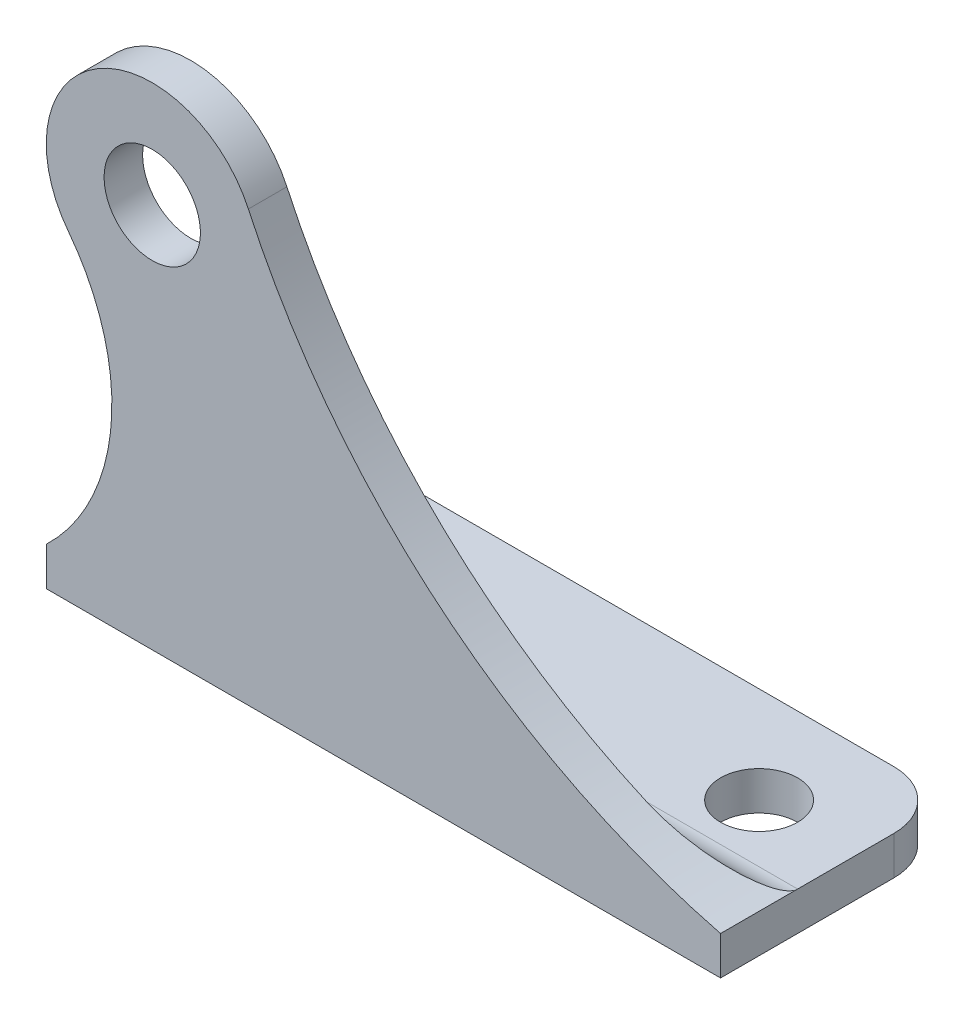
ISO-10303-21;
HEADER;
FILE_DESCRIPTION(('STEP AP214'),'2;1');
FILE_NAME('part.step','',(''),(''),'','','');
FILE_SCHEMA(('AUTOMOTIVE_DESIGN { 1 0 10303 214 1 1 1 1 }'));
ENDSEC;
DATA;
#1=APPLICATION_CONTEXT('core data for automotive mechanical design processes');
#2=APPLICATION_PROTOCOL_DEFINITION('international standard','automotive_design',2000,#1);
#3=PRODUCT_CONTEXT('',#1,'mechanical');
#4=PRODUCT('Part','Part','',(#3));
#5=PRODUCT_RELATED_PRODUCT_CATEGORY('part','',(#4));
#6=PRODUCT_DEFINITION_FORMATION('','',#4);
#7=PRODUCT_DEFINITION_CONTEXT('part definition',#1,'design');
#8=PRODUCT_DEFINITION('design','',#6,#7);
#9=PRODUCT_DEFINITION_SHAPE('','',#8);
#10=(LENGTH_UNIT() NAMED_UNIT(*) SI_UNIT(.MILLI.,.METRE.));
#11=(NAMED_UNIT(*) PLANE_ANGLE_UNIT() SI_UNIT($,.RADIAN.));
#12=(NAMED_UNIT(*) SI_UNIT($,.STERADIAN.) SOLID_ANGLE_UNIT());
#13=UNCERTAINTY_MEASURE_WITH_UNIT(LENGTH_MEASURE(1.E-05),#10,'distance_accuracy_value','');
#14=(GEOMETRIC_REPRESENTATION_CONTEXT(3) GLOBAL_UNCERTAINTY_ASSIGNED_CONTEXT((#13)) GLOBAL_UNIT_ASSIGNED_CONTEXT((#10,
#11,#12)) REPRESENTATION_CONTEXT('',''));
#15=CARTESIAN_POINT('',(0.,0.,0.));
#16=DIRECTION('',(0.,0.,1.));
#17=DIRECTION('',(1.,0.,0.));
#18=AXIS2_PLACEMENT_3D('',#15,#16,#17);
#19=CARTESIAN_POINT('',(29.5,0.,2.));
#20=DIRECTION('',(0.,1.,0.));
#21=DIRECTION('',(-1.,0.,0.));
#22=AXIS2_PLACEMENT_3D('',#19,#20,#21);
#23=PLANE('',#22);
#24=CARTESIAN_POINT('',(-0.500000000000004,0.,-7.));
#25=DIRECTION('',(0.,-1.,0.));
#26=DIRECTION('',(0.,0.,-1.));
#27=AXIS2_PLACEMENT_3D('',#24,#25,#26);
#28=CIRCLE('',#27,2.);
#29=CARTESIAN_POINT('',(-0.500000000000004,0.,-9.));
#30=VERTEX_POINT('',#29);
#31=EDGE_CURVE('E216',#30,#30,#28,.T.);
#32=ORIENTED_EDGE('',*,*,#31,.F.);
#33=EDGE_LOOP('',(#32));
#34=FACE_BOUND('',#33,.T.);
#35=CARTESIAN_POINT('',(24.5,0.,-7.));
#36=DIRECTION('',(0.,-1.,0.));
#37=DIRECTION('',(0.,0.,-1.));
#38=AXIS2_PLACEMENT_3D('',#35,#36,#37);
#39=CIRCLE('',#38,2.);
#40=CARTESIAN_POINT('',(24.5,0.,-9.));
#41=VERTEX_POINT('',#40);
#42=EDGE_CURVE('E219',#41,#41,#39,.T.);
#43=ORIENTED_EDGE('',*,*,#42,.F.);
#44=EDGE_LOOP('',(#43));
#45=FACE_BOUND('',#44,.T.);
#46=DIRECTION('',(0.,0.,-1.));
#47=VECTOR('',#46,1.);
#48=CARTESIAN_POINT('',(29.5,0.,2.));
#49=LINE('',#48,#47);
#50=CARTESIAN_POINT('',(29.5,0.,0.));
#51=VERTEX_POINT('',#50);
#52=CARTESIAN_POINT('',(29.5,0.,-9.));
#53=VERTEX_POINT('',#52);
#54=EDGE_CURVE('E130',#51,#53,#49,.T.);
#55=ORIENTED_EDGE('',*,*,#54,.F.);
#56=DIRECTION('',(1.,0.,0.));
#57=VECTOR('',#56,1.);
#58=CARTESIAN_POINT('',(-5.6798460655518,0.,0.));
#59=LINE('',#58,#57);
#60=CARTESIAN_POINT('',(-5.5,0.,0.));
#61=VERTEX_POINT('',#60);
#62=EDGE_CURVE('E118',#61,#51,#59,.T.);
#63=ORIENTED_EDGE('',*,*,#62,.F.);
#64=DIRECTION('',(0.,0.,-1.));
#65=VECTOR('',#64,1.);
#66=CARTESIAN_POINT('',(-5.5,0.,2.));
#67=LINE('',#66,#65);
#68=CARTESIAN_POINT('',(-5.5,0.,-9.));
#69=VERTEX_POINT('',#68);
#70=EDGE_CURVE('E127',#61,#69,#67,.T.);
#71=ORIENTED_EDGE('',*,*,#70,.T.);
#72=CARTESIAN_POINT('',(-2.5,0.,-9.));
#73=DIRECTION('',(0.,1.,0.));
#74=DIRECTION('',(-1.,0.,0.));
#75=AXIS2_PLACEMENT_3D('',#72,#73,#74);
#76=CIRCLE('',#75,3.);
#77=CARTESIAN_POINT('',(-2.5,0.,-12.));
#78=VERTEX_POINT('',#77);
#79=EDGE_CURVE('E313',#69,#78,#76,.F.);
#80=ORIENTED_EDGE('',*,*,#79,.T.);
#81=DIRECTION('',(1.,0.,0.));
#82=VECTOR('',#81,1.);
#83=CARTESIAN_POINT('',(-5.5,0.,-12.));
#84=LINE('',#83,#82);
#85=CARTESIAN_POINT('',(26.5,0.,-12.));
#86=VERTEX_POINT('',#85);
#87=EDGE_CURVE('E238',#78,#86,#84,.T.);
#88=ORIENTED_EDGE('',*,*,#87,.T.);
#89=CARTESIAN_POINT('',(26.5,0.,-9.));
#90=DIRECTION('',(0.,1.,0.));
#91=DIRECTION('',(-1.,0.,0.));
#92=AXIS2_PLACEMENT_3D('',#89,#90,#91);
#93=CIRCLE('',#92,3.);
#94=EDGE_CURVE('E316',#86,#53,#93,.F.);
#95=ORIENTED_EDGE('',*,*,#94,.T.);
#96=EDGE_LOOP('',(#55,#63,#71,#80,#88,#95));
#97=FACE_BOUND('',#96,.T.);
#98=ADVANCED_FACE('F39',(#34,#45,#97),#23,.F.);
#99=CARTESIAN_POINT('',(29.5,2.,2.));
#100=DIRECTION('',(-1.,0.,0.));
#101=DIRECTION('',(0.,0.,1.));
#102=AXIS2_PLACEMENT_3D('',#99,#100,#101);
#103=PLANE('',#102);
#104=DIRECTION('',(0.,0.,-1.));
#105=VECTOR('',#104,1.);
#106=CARTESIAN_POINT('',(29.5,2.00000000000001,2.));
#107=LINE('',#106,#105);
#108=CARTESIAN_POINT('',(29.5,2.00000000000001,0.));
#109=VERTEX_POINT('',#108);
#110=CARTESIAN_POINT('',(29.5,2.00000000000001,-4.));
#111=VERTEX_POINT('',#110);
#112=EDGE_CURVE('E156',#109,#111,#107,.T.);
#113=ORIENTED_EDGE('',*,*,#112,.F.);
#114=DIRECTION('',(0.,-1.,0.));
#115=VECTOR('',#114,1.);
#116=CARTESIAN_POINT('',(29.5,2.,0.));
#117=LINE('',#116,#115);
#118=EDGE_CURVE('E230',#109,#51,#117,.T.);
#119=ORIENTED_EDGE('',*,*,#118,.T.);
#120=ORIENTED_EDGE('',*,*,#54,.T.);
#121=DIRECTION('',(0.,1.,0.));
#122=VECTOR('',#121,1.);
#123=CARTESIAN_POINT('',(29.5,2.,-9.));
#124=LINE('',#123,#122);
#125=CARTESIAN_POINT('',(29.5,2.00000000000001,-9.));
#126=VERTEX_POINT('',#125);
#127=EDGE_CURVE('E11',#53,#126,#124,.T.);
#128=ORIENTED_EDGE('',*,*,#127,.T.);
#129=DIRECTION('',(0.,0.,1.));
#130=VECTOR('',#129,1.);
#131=CARTESIAN_POINT('',(29.5,2.00000000000001,-12.));
#132=LINE('',#131,#130);
#133=EDGE_CURVE('E242',#126,#111,#132,.T.);
#134=ORIENTED_EDGE('',*,*,#133,.T.);
#135=EDGE_LOOP('',(#113,#119,#120,#128,#134));
#136=FACE_BOUND('',#135,.T.);
#137=ADVANCED_FACE('F206',(#136),#103,.F.);
#138=CARTESIAN_POINT('',(38.5586813816439,37.8739500421386,2.));
#139=DIRECTION('',(0.,0.,-1.));
#140=DIRECTION('',(-1.,0.,0.));
#141=AXIS2_PLACEMENT_3D('',#138,#139,#140);
#142=CYLINDRICAL_SURFACE('',#141,37.);
#143=DIRECTION('',(0.,0.,-1.));
#144=VECTOR('',#143,1.);
#145=CARTESIAN_POINT('',(4.98994700233039,22.3130994172179,2.));
#146=LINE('',#145,#144);
#147=CARTESIAN_POINT('',(4.98994700233039,22.3130994172179,0.));
#148=VERTEX_POINT('',#147);
#149=CARTESIAN_POINT('',(4.98994700233039,22.3130994172179,-2.));
#150=VERTEX_POINT('',#149);
#151=EDGE_CURVE('E153',#148,#150,#146,.T.);
#152=ORIENTED_EDGE('',*,*,#151,.F.);
#153=CARTESIAN_POINT('',(38.5586813816439,37.8739500421386,0.));
#154=DIRECTION('',(0.,0.,-1.));
#155=DIRECTION('',(-1.,0.,0.));
#156=AXIS2_PLACEMENT_3D('',#153,#154,#155);
#157=CIRCLE('',#156,37.);
#158=EDGE_CURVE('E276',#148,#109,#157,.F.);
#159=ORIENTED_EDGE('',*,*,#158,.T.);
#160=ORIENTED_EDGE('',*,*,#112,.T.);
#161=CARTESIAN_POINT('',(29.5,2.00000000000001,-4.));
#162=CARTESIAN_POINT('',(29.500137190227,1.99996694012883,-3.9649529156728));
#163=CARTESIAN_POINT('',(29.4963576987812,2.0009195686309,-3.93013838617993));
#164=CARTESIAN_POINT('',(29.4823615403127,2.00445748941793,-3.86252321380909));
#165=CARTESIAN_POINT('',(29.4722599738624,2.00701359056038,-3.82969783474069));
#166=CARTESIAN_POINT('',(29.4437165720005,2.01425584786259,-3.75826178879602));
#167=CARTESIAN_POINT('',(29.4238089447934,2.01931788915426,-3.720296291013));
#168=CARTESIAN_POINT('',(29.3784511233382,2.03090431527606,-3.64783706526799));
#169=CARTESIAN_POINT('',(29.3529609980963,2.03743924587413,-3.61337111211238));
#170=CARTESIAN_POINT('',(29.2998399890961,2.05112815490034,-3.54955154571209));
#171=CARTESIAN_POINT('',(29.2724029434124,2.05822859117009,-3.52002128519595));
#172=CARTESIAN_POINT('',(29.2152370431187,2.07309918422405,-3.46342806353568));
#173=CARTESIAN_POINT('',(29.1855059767225,2.08086998821896,-3.43636753986517));
#174=CARTESIAN_POINT('',(29.1243733326221,2.09693462222927,-3.38430112222026));
#175=CARTESIAN_POINT('',(29.0929694962181,2.10522916238402,-3.35929812859539));
#176=CARTESIAN_POINT('',(29.0289657744183,2.12222814939686,-3.31106971438388));
#177=CARTESIAN_POINT('',(28.9963664218772,2.13093241411514,-3.28784351576913));
#178=CARTESIAN_POINT('',(28.9067386974198,2.15499954125088,-3.22689582803461));
#179=CARTESIAN_POINT('',(28.8488235716297,2.17069579428164,-3.1906117341689));
#180=CARTESIAN_POINT('',(28.7311986930137,2.20289290097465,-3.1214483857657));
#181=CARTESIAN_POINT('',(28.6714879067204,2.21939422151852,-3.08857114232526));
#182=CARTESIAN_POINT('',(28.4902865684582,2.26997372658143,-2.99393523223508));
#183=CARTESIAN_POINT('',(28.3669298160463,2.30507318155737,-2.93630203674125));
#184=CARTESIAN_POINT('',(28.1165030744793,2.3777796560007,-2.82840504689361));
#185=CARTESIAN_POINT('',(27.989410226759,2.41540570232408,-2.77820914577354));
#186=CARTESIAN_POINT('',(27.7336853749487,2.49263743235083,-2.68411420928517));
#187=CARTESIAN_POINT('',(27.6050551282014,2.53224099468853,-2.64020861374823));
#188=CARTESIAN_POINT('',(27.3153155824425,2.62320461781858,-2.54754864085604));
#189=CARTESIAN_POINT('',(27.1539171677992,2.67508100949178,-2.50021287506477));
#190=CARTESIAN_POINT('',(26.8301486114879,2.78163491449502,-2.41244099833836));
#191=CARTESIAN_POINT('',(26.6677782733617,2.83631301227621,-2.37200633469215));
#192=CARTESIAN_POINT('',(26.3423232862009,2.94845422829478,-2.29741656448136));
#193=CARTESIAN_POINT('',(26.1792379955163,3.00592076362842,-2.26326942176385));
#194=CARTESIAN_POINT('',(25.8528687874694,3.12351961057592,-2.20105430794035));
#195=CARTESIAN_POINT('',(25.6895848678098,3.18365195331253,-2.1729864078308));
#196=CARTESIAN_POINT('',(25.3711493629947,3.30349312567193,-2.12413892066068));
#197=CARTESIAN_POINT('',(25.2159950101901,3.36307578892914,-2.10306750604076));
#198=CARTESIAN_POINT('',(24.9059393424424,3.48455691614844,-2.0665213385381));
#199=CARTESIAN_POINT('',(24.7510380175779,3.54645528691808,-2.05104636070126));
#200=CARTESIAN_POINT('',(24.4420458197137,3.67236595719403,-2.0259752121091));
#201=CARTESIAN_POINT('',(24.2879538949267,3.73637286378578,-2.01636511058619));
#202=CARTESIAN_POINT('',(23.9804080348559,3.86657032035902,-2.0033904396352));
#203=CARTESIAN_POINT('',(23.8269541933469,3.93276117935947,-2.00002675793654));
#204=CARTESIAN_POINT('',(23.6739405863631,4.00000000000001,-1.99999999999999));
#205=B_SPLINE_CURVE_WITH_KNOTS('',3,(#161,#162,#163,#164,#165,#166,#167,#168,#169,#170,#171,
#172,#173,#174,#175,#176,#177,#178,#179,#180,#181,#182,#183,#184,#185,#186,#187,#188,#189,#190,
#191,#192,#193,#194,#195,#196,#197,#198,#199,#200,#201,#202,#203,#204),.UNSPECIFIED.,.F.,.F.,(4,
2,2,2,2,2,2,2,2,2,2,2,2,2,2,2,2,2,2,2,2,4),(0.,0.104555420053164,0.207260551466355,
0.336023241561873,0.465738926203841,0.588346805366283,0.711074410983963,0.833972154499699,
0.956815771446174,1.16701588451927,1.37733938225322,1.79872360091374,2.22374451451331,
2.64831889525641,3.17617508144666,3.70414183319066,4.23277278149027,4.76140990307489,
5.2638994768531,5.76636885033901,6.26764002152068,6.7689824269659),.UNSPECIFIED.);
#206=CARTESIAN_POINT('',(23.6739405863631,4.00000000000001,-2.));
#207=VERTEX_POINT('',#206);
#208=EDGE_CURVE('E179',#111,#207,#205,.T.);
#209=ORIENTED_EDGE('',*,*,#208,.T.);
#210=CARTESIAN_POINT('',(38.5586813816439,37.8739500421386,-2.));
#211=DIRECTION('',(0.,0.,-1.));
#212=DIRECTION('',(1.,0.,0.));
#213=AXIS2_PLACEMENT_3D('',#210,#211,#212);
#214=CIRCLE('',#213,37.);
#215=EDGE_CURVE('E140',#207,#150,#214,.T.);
#216=ORIENTED_EDGE('',*,*,#215,.T.);
#217=EDGE_LOOP('',(#152,#159,#160,#209,#216));
#218=FACE_BOUND('',#217,.T.);
#219=ADVANCED_FACE('F211',(#218),#142,.F.);
#220=CARTESIAN_POINT('',(0.,20.,2.));
#221=DIRECTION('',(0.,0.,-1.));
#222=DIRECTION('',(-1.,0.,0.));
#223=AXIS2_PLACEMENT_3D('',#220,#221,#222);
#224=CYLINDRICAL_SURFACE('',#223,5.5);
#225=DIRECTION('',(0.,0.,-1.));
#226=VECTOR('',#225,1.);
#227=CARTESIAN_POINT('',(-4.36435182332032,16.652996390459,2.));
#228=LINE('',#227,#226);
#229=CARTESIAN_POINT('',(-4.36435182332032,16.652996390459,0.));
#230=VERTEX_POINT('',#229);
#231=CARTESIAN_POINT('',(-4.36435182332032,16.652996390459,-2.));
#232=VERTEX_POINT('',#231);
#233=EDGE_CURVE('E144',#230,#232,#228,.T.);
#234=ORIENTED_EDGE('',*,*,#233,.F.);
#235=CARTESIAN_POINT('',(0.,20.,0.));
#236=DIRECTION('',(0.,0.,-1.));
#237=DIRECTION('',(-1.,0.,0.));
#238=AXIS2_PLACEMENT_3D('',#235,#236,#237);
#239=CIRCLE('',#238,5.5);
#240=EDGE_CURVE('E273',#230,#148,#239,.T.);
#241=ORIENTED_EDGE('',*,*,#240,.T.);
#242=ORIENTED_EDGE('',*,*,#151,.T.);
#243=CARTESIAN_POINT('',(0.,20.,-2.));
#244=DIRECTION('',(0.,0.,1.));
#245=DIRECTION('',(1.,0.,0.));
#246=AXIS2_PLACEMENT_3D('',#243,#244,#245);
#247=CIRCLE('',#246,5.5);
#248=EDGE_CURVE('E147',#150,#232,#247,.T.);
#249=ORIENTED_EDGE('',*,*,#248,.T.);
#250=EDGE_LOOP('',(#234,#241,#242,#249));
#251=FACE_BOUND('',#250,.T.);
#252=ADVANCED_FACE('F262',(#251),#224,.T.);
#253=CARTESIAN_POINT('',(-13.093055469961,9.95898917137696,2.));
#254=DIRECTION('',(0.,0.,-1.));
#255=DIRECTION('',(-1.,0.,0.));
#256=AXIS2_PLACEMENT_3D('',#253,#254,#255);
#257=CYLINDRICAL_SURFACE('',#256,11.);
#258=DIRECTION('',(0.,0.,-1.));
#259=VECTOR('',#258,1.);
#260=CARTESIAN_POINT('',(-5.5,2.,2.));
#261=LINE('',#260,#259);
#262=CARTESIAN_POINT('',(-5.5,2.,0.));
#263=VERTEX_POINT('',#262);
#264=CARTESIAN_POINT('',(-5.5,2.00000000000001,-4.));
#265=VERTEX_POINT('',#264);
#266=EDGE_CURVE('E139',#263,#265,#261,.T.);
#267=ORIENTED_EDGE('',*,*,#266,.F.);
#268=CARTESIAN_POINT('',(-13.093055469961,9.95898917137696,0.));
#269=DIRECTION('',(0.,0.,-1.));
#270=DIRECTION('',(-1.,0.,0.));
#271=AXIS2_PLACEMENT_3D('',#268,#269,#270);
#272=CIRCLE('',#271,11.);
#273=EDGE_CURVE('E56',#263,#230,#272,.F.);
#274=ORIENTED_EDGE('',*,*,#273,.T.);
#275=ORIENTED_EDGE('',*,*,#233,.T.);
#276=CARTESIAN_POINT('',(-13.093055469961,9.95898917137696,-2.));
#277=DIRECTION('',(0.,0.,-1.));
#278=DIRECTION('',(-1.,0.,0.));
#279=AXIS2_PLACEMENT_3D('',#276,#277,#278);
#280=CIRCLE('',#279,11.);
#281=CARTESIAN_POINT('',(-3.84695098994279,4.00000000000001,-2.));
#282=VERTEX_POINT('',#281);
#283=EDGE_CURVE('E254',#232,#282,#280,.T.);
#284=ORIENTED_EDGE('',*,*,#283,.T.);
#285=CARTESIAN_POINT('',(-3.84695098994279,4.00000000000001,-2.));
#286=CARTESIAN_POINT('',(-3.89300953925943,3.92851663893945,-2.00000584144798));
#287=CARTESIAN_POINT('',(-3.93989681105139,3.85760291705831,-2.00383169437765));
#288=CARTESIAN_POINT('',(-4.03490481162779,3.71743359639504,-2.01880661262718));
#289=CARTESIAN_POINT('',(-4.08302499993598,3.64817729595127,-2.0299525200895));
#290=CARTESIAN_POINT('',(-4.18023919825523,3.51160506225537,-2.05928868611961));
#291=CARTESIAN_POINT('',(-4.22933538091585,3.4442945345411,-2.07749685742963));
#292=CARTESIAN_POINT('',(-4.32793999426126,3.31221897206055,-2.12069550120881));
#293=CARTESIAN_POINT('',(-4.37744846026596,3.24745415815912,-2.1456865606776));
#294=CARTESIAN_POINT('',(-4.52220388001074,3.06229954853471,-2.22840855534248));
#295=CARTESIAN_POINT('',(-4.61746882274678,2.94577223583249,-2.29506164294306));
#296=CARTESIAN_POINT('',(-4.80392836443223,2.72635152086218,-2.45209464852238));
#297=CARTESIAN_POINT('',(-4.89512785566671,2.62344142116876,-2.54244509547242));
#298=CARTESIAN_POINT('',(-5.04271260601219,2.46230680194305,-2.71733844553586));
#299=CARTESIAN_POINT('',(-5.10150179307957,2.3997967653404,-2.7959097576801));
#300=CARTESIAN_POINT('',(-5.21128569142286,2.2854010506372,-2.96532125624976));
#301=CARTESIAN_POINT('',(-5.26229280034241,2.23349842808392,-3.05614148459978));
#302=CARTESIAN_POINT('',(-5.34235965719829,2.15327435589252,-3.22770859180503));
#303=CARTESIAN_POINT('',(-5.37377429304055,2.12227454211262,-3.30609396909187));
#304=CARTESIAN_POINT('',(-5.4272958513618,2.06991225644418,-3.4689330497819));
#305=CARTESIAN_POINT('',(-5.44942730087893,2.0485243781046,-3.55337006334288));
#306=CARTESIAN_POINT('',(-5.47702823219456,2.02196329930188,-3.69847299707504));
#307=CARTESIAN_POINT('',(-5.48556965453712,2.01378506961867,-3.75801970586104));
#308=CARTESIAN_POINT('',(-5.49708867629248,2.00277734780867,-3.87835230426415));
#309=CARTESIAN_POINT('',(-5.5000457206973,1.99996761563231,-3.93914194260127));
#310=CARTESIAN_POINT('',(-5.49999999999999,2.00000000000001,-4.));
#311=B_SPLINE_CURVE_WITH_KNOTS('',3,(#285,#286,#287,#288,#289,#290,#291,#292,#293,#294,#295,
#296,#297,#298,#299,#300,#301,#302,#303,#304,#305,#306,#307,#308,#309,#310),.UNSPECIFIED.,.F.,
.F.,(4,2,2,2,2,2,2,2,2,2,2,2,4),(0.,0.254974708714898,0.509839494016612,0.76535499145355,
1.02089260857618,1.5124085790858,2.00331615450912,2.3512582196076,2.69864005565889,
2.96752094722782,3.23568688631254,3.41733950742979,3.59965946307042),.UNSPECIFIED.);
#312=EDGE_CURVE('E169',#282,#265,#311,.T.);
#313=ORIENTED_EDGE('',*,*,#312,.T.);
#314=EDGE_LOOP('',(#267,#274,#275,#284,#313));
#315=FACE_BOUND('',#314,.T.);
#316=ADVANCED_FACE('F186',(#315),#257,.F.);
#317=CARTESIAN_POINT('',(-5.5,0.,2.));
#318=DIRECTION('',(1.,0.,0.));
#319=DIRECTION('',(0.,1.,0.));
#320=AXIS2_PLACEMENT_3D('',#317,#318,#319);
#321=PLANE('',#320);
#322=ORIENTED_EDGE('',*,*,#70,.F.);
#323=DIRECTION('',(0.,1.,0.));
#324=VECTOR('',#323,1.);
#325=CARTESIAN_POINT('',(-5.5,0.,0.));
#326=LINE('',#325,#324);
#327=EDGE_CURVE('E115',#61,#263,#326,.T.);
#328=ORIENTED_EDGE('',*,*,#327,.T.);
#329=ORIENTED_EDGE('',*,*,#266,.T.);
#330=DIRECTION('',(0.,0.,1.));
#331=VECTOR('',#330,1.);
#332=CARTESIAN_POINT('',(-5.5,2.00000000000001,-12.));
#333=LINE('',#332,#331);
#334=CARTESIAN_POINT('',(-5.5,2.00000000000001,-9.));
#335=VERTEX_POINT('',#334);
#336=EDGE_CURVE('E246',#335,#265,#333,.T.);
#337=ORIENTED_EDGE('',*,*,#336,.F.);
#338=DIRECTION('',(0.,-1.,0.));
#339=VECTOR('',#338,1.);
#340=CARTESIAN_POINT('',(-5.5,0.,-9.));
#341=LINE('',#340,#339);
#342=EDGE_CURVE('E137',#335,#69,#341,.T.);
#343=ORIENTED_EDGE('',*,*,#342,.T.);
#344=EDGE_LOOP('',(#322,#328,#329,#337,#343));
#345=FACE_BOUND('',#344,.T.);
#346=ADVANCED_FACE('F134',(#345),#321,.F.);
#347=CARTESIAN_POINT('',(0.,20.,2.));
#348=DIRECTION('',(0.,0.,-1.));
#349=DIRECTION('',(-1.,0.,0.));
#350=AXIS2_PLACEMENT_3D('',#347,#348,#349);
#351=CYLINDRICAL_SURFACE('',#350,2.5);
#352=CARTESIAN_POINT('',(0.,20.,0.));
#353=DIRECTION('',(0.,0.,-1.));
#354=DIRECTION('',(-1.,0.,0.));
#355=AXIS2_PLACEMENT_3D('',#352,#353,#354);
#356=CIRCLE('',#355,2.5);
#357=CARTESIAN_POINT('',(-2.5,20.,0.));
#358=VERTEX_POINT('',#357);
#359=EDGE_CURVE('E43',#358,#358,#356,.T.);
#360=ORIENTED_EDGE('',*,*,#359,.F.);
#361=EDGE_LOOP('',(#360));
#362=FACE_BOUND('',#361,.T.);
#363=CARTESIAN_POINT('',(0.,20.,-2.));
#364=DIRECTION('',(0.,0.,1.));
#365=DIRECTION('',(1.,0.,0.));
#366=AXIS2_PLACEMENT_3D('',#363,#364,#365);
#367=CIRCLE('',#366,2.5);
#368=CARTESIAN_POINT('',(2.5,20.,-2.));
#369=VERTEX_POINT('',#368);
#370=EDGE_CURVE('E250',#369,#369,#367,.T.);
#371=ORIENTED_EDGE('',*,*,#370,.F.);
#372=EDGE_LOOP('',(#371));
#373=FACE_BOUND('',#372,.T.);
#374=ADVANCED_FACE('F334',(#362,#373),#351,.F.);
#375=CARTESIAN_POINT('',(-13.093055469961,9.95898917137696,-2.));
#376=DIRECTION('',(0.,0.,1.));
#377=DIRECTION('',(-1.,0.,0.));
#378=AXIS2_PLACEMENT_3D('',#375,#376,#377);
#379=PLANE('',#378);
#380=ORIENTED_EDGE('',*,*,#370,.T.);
#381=EDGE_LOOP('',(#380));
#382=FACE_BOUND('',#381,.T.);
#383=ORIENTED_EDGE('',*,*,#215,.F.);
#384=DIRECTION('',(-1.,0.,0.));
#385=VECTOR('',#384,1.);
#386=CARTESIAN_POINT('',(-13.093055469961,4.00000000000001,-2.));
#387=LINE('',#386,#385);
#388=EDGE_CURVE('E161',#207,#282,#387,.T.);
#389=ORIENTED_EDGE('',*,*,#388,.T.);
#390=ORIENTED_EDGE('',*,*,#283,.F.);
#391=ORIENTED_EDGE('',*,*,#248,.F.);
#392=EDGE_LOOP('',(#383,#389,#390,#391));
#393=FACE_BOUND('',#392,.T.);
#394=ADVANCED_FACE('F268',(#382,#393),#379,.F.);
#395=CARTESIAN_POINT('',(-5.5,2.00000000000001,-12.));
#396=DIRECTION('',(0.,1.,0.));
#397=DIRECTION('',(0.,0.,1.));
#398=AXIS2_PLACEMENT_3D('',#395,#396,#397);
#399=PLANE('',#398);
#400=CARTESIAN_POINT('',(-0.500000000000004,2.00000000000001,-7.));
#401=DIRECTION('',(0.,-1.,0.));
#402=DIRECTION('',(0.,0.,-1.));
#403=AXIS2_PLACEMENT_3D('',#400,#401,#402);
#404=CIRCLE('',#403,2.);
#405=CARTESIAN_POINT('',(-0.500000000000004,2.00000000000001,-9.));
#406=VERTEX_POINT('',#405);
#407=EDGE_CURVE('E222',#406,#406,#404,.T.);
#408=ORIENTED_EDGE('',*,*,#407,.T.);
#409=EDGE_LOOP('',(#408));
#410=FACE_BOUND('',#409,.T.);
#411=CARTESIAN_POINT('',(24.5,2.00000000000001,-7.));
#412=DIRECTION('',(0.,-1.,0.));
#413=DIRECTION('',(0.,0.,-1.));
#414=AXIS2_PLACEMENT_3D('',#411,#412,#413);
#415=CIRCLE('',#414,2.);
#416=CARTESIAN_POINT('',(24.5,2.00000000000001,-9.));
#417=VERTEX_POINT('',#416);
#418=EDGE_CURVE('E223',#417,#417,#415,.T.);
#419=ORIENTED_EDGE('',*,*,#418,.T.);
#420=EDGE_LOOP('',(#419));
#421=FACE_BOUND('',#420,.T.);
#422=DIRECTION('',(-1.,0.,0.));
#423=VECTOR('',#422,1.);
#424=CARTESIAN_POINT('',(-5.5,2.00000000000001,-12.));
#425=LINE('',#424,#423);
#426=CARTESIAN_POINT('',(26.5,2.00000000000001,-12.));
#427=VERTEX_POINT('',#426);
#428=CARTESIAN_POINT('',(-2.5,2.00000000000001,-12.));
#429=VERTEX_POINT('',#428);
#430=EDGE_CURVE('E234',#427,#429,#425,.T.);
#431=ORIENTED_EDGE('',*,*,#430,.T.);
#432=CARTESIAN_POINT('',(-2.5,2.00000000000001,-9.));
#433=DIRECTION('',(0.,1.,0.));
#434=DIRECTION('',(0.,0.,1.));
#435=AXIS2_PLACEMENT_3D('',#432,#433,#434);
#436=CIRCLE('',#435,3.);
#437=EDGE_CURVE('E49',#429,#335,#436,.T.);
#438=ORIENTED_EDGE('',*,*,#437,.T.);
#439=ORIENTED_EDGE('',*,*,#336,.T.);
#440=DIRECTION('',(-1.,0.,0.));
#441=VECTOR('',#440,1.);
#442=CARTESIAN_POINT('',(-5.5,2.00000000000001,-4.));
#443=LINE('',#442,#441);
#444=EDGE_CURVE('E165',#265,#111,#443,.F.);
#445=ORIENTED_EDGE('',*,*,#444,.T.);
#446=ORIENTED_EDGE('',*,*,#133,.F.);
#447=CARTESIAN_POINT('',(26.5,2.00000000000001,-9.));
#448=DIRECTION('',(0.,1.,0.));
#449=DIRECTION('',(0.,0.,1.));
#450=AXIS2_PLACEMENT_3D('',#447,#448,#449);
#451=CIRCLE('',#450,3.);
#452=EDGE_CURVE('E64',#126,#427,#451,.T.);
#453=ORIENTED_EDGE('',*,*,#452,.T.);
#454=EDGE_LOOP('',(#431,#438,#439,#445,#446,#453));
#455=FACE_BOUND('',#454,.T.);
#456=ADVANCED_FACE('F291',(#410,#421,#455),#399,.T.);
#457=CARTESIAN_POINT('',(0.,0.,-12.));
#458=DIRECTION('',(0.,0.,1.));
#459=DIRECTION('',(-1.,0.,0.));
#460=AXIS2_PLACEMENT_3D('',#457,#458,#459);
#461=PLANE('',#460);
#462=ORIENTED_EDGE('',*,*,#87,.F.);
#463=DIRECTION('',(0.,-1.,0.));
#464=VECTOR('',#463,1.);
#465=CARTESIAN_POINT('',(-2.5,0.,-12.));
#466=LINE('',#465,#464);
#467=EDGE_CURVE('E302',#78,#429,#466,.F.);
#468=ORIENTED_EDGE('',*,*,#467,.T.);
#469=ORIENTED_EDGE('',*,*,#430,.F.);
#470=DIRECTION('',(0.,1.,0.));
#471=VECTOR('',#470,1.);
#472=CARTESIAN_POINT('',(26.5,0.,-12.));
#473=LINE('',#472,#471);
#474=EDGE_CURVE('E310',#427,#86,#473,.F.);
#475=ORIENTED_EDGE('',*,*,#474,.T.);
#476=EDGE_LOOP('',(#462,#468,#469,#475));
#477=FACE_BOUND('',#476,.T.);
#478=ADVANCED_FACE('F294',(#477),#461,.F.);
#479=CARTESIAN_POINT('',(24.5,0.,-7.));
#480=DIRECTION('',(0.,1.,0.));
#481=DIRECTION('',(0.,0.,1.));
#482=AXIS2_PLACEMENT_3D('',#479,#480,#481);
#483=CYLINDRICAL_SURFACE('',#482,2.);
#484=ORIENTED_EDGE('',*,*,#42,.T.);
#485=EDGE_LOOP('',(#484));
#486=FACE_BOUND('',#485,.T.);
#487=ORIENTED_EDGE('',*,*,#418,.F.);
#488=EDGE_LOOP('',(#487));
#489=FACE_BOUND('',#488,.T.);
#490=ADVANCED_FACE('F287',(#486,#489),#483,.F.);
#491=CARTESIAN_POINT('',(-0.500000000000004,0.,-7.));
#492=DIRECTION('',(0.,1.,0.));
#493=DIRECTION('',(0.,0.,1.));
#494=AXIS2_PLACEMENT_3D('',#491,#492,#493);
#495=CYLINDRICAL_SURFACE('',#494,2.);
#496=ORIENTED_EDGE('',*,*,#31,.T.);
#497=EDGE_LOOP('',(#496));
#498=FACE_BOUND('',#497,.T.);
#499=ORIENTED_EDGE('',*,*,#407,.F.);
#500=EDGE_LOOP('',(#499));
#501=FACE_BOUND('',#500,.T.);
#502=ADVANCED_FACE('F195',(#498,#501),#495,.F.);
#503=CARTESIAN_POINT('',(-13.093055469961,4.00000000000001,-4.));
#504=DIRECTION('',(-1.,0.,0.));
#505=DIRECTION('',(0.,0.,1.));
#506=AXIS2_PLACEMENT_3D('',#503,#504,#505);
#507=CYLINDRICAL_SURFACE('',#506,2.);
#508=ORIENTED_EDGE('',*,*,#208,.F.);
#509=ORIENTED_EDGE('',*,*,#444,.F.);
#510=ORIENTED_EDGE('',*,*,#312,.F.);
#511=ORIENTED_EDGE('',*,*,#388,.F.);
#512=EDGE_LOOP('',(#508,#509,#510,#511));
#513=FACE_BOUND('',#512,.T.);
#514=ADVANCED_FACE('F190',(#513),#507,.F.);
#515=CARTESIAN_POINT('',(-2.5,0.,-9.));
#516=DIRECTION('',(0.,-1.,0.));
#517=DIRECTION('',(1.,0.,0.));
#518=AXIS2_PLACEMENT_3D('',#515,#516,#517);
#519=CYLINDRICAL_SURFACE('',#518,3.);
#520=ORIENTED_EDGE('',*,*,#437,.F.);
#521=ORIENTED_EDGE('',*,*,#467,.F.);
#522=ORIENTED_EDGE('',*,*,#79,.F.);
#523=ORIENTED_EDGE('',*,*,#342,.F.);
#524=EDGE_LOOP('',(#520,#521,#522,#523));
#525=FACE_BOUND('',#524,.T.);
#526=ADVANCED_FACE('F194',(#525),#519,.T.);
#527=CARTESIAN_POINT('',(26.5,2.,-9.));
#528=DIRECTION('',(0.,1.,0.));
#529=DIRECTION('',(0.,0.,1.));
#530=AXIS2_PLACEMENT_3D('',#527,#528,#529);
#531=CYLINDRICAL_SURFACE('',#530,3.);
#532=ORIENTED_EDGE('',*,*,#94,.F.);
#533=ORIENTED_EDGE('',*,*,#474,.F.);
#534=ORIENTED_EDGE('',*,*,#452,.F.);
#535=ORIENTED_EDGE('',*,*,#127,.F.);
#536=EDGE_LOOP('',(#532,#533,#534,#535));
#537=FACE_BOUND('',#536,.T.);
#538=ADVANCED_FACE('F41',(#537),#531,.T.);
#539=CARTESIAN_POINT('',(-5.6798460655518,0.,0.));
#540=DIRECTION('',(0.,0.,-1.));
#541=DIRECTION('',(-1.,0.,0.));
#542=AXIS2_PLACEMENT_3D('',#539,#540,#541);
#543=PLANE('',#542);
#544=ORIENTED_EDGE('',*,*,#359,.T.);
#545=EDGE_LOOP('',(#544));
#546=FACE_BOUND('',#545,.T.);
#547=ORIENTED_EDGE('',*,*,#158,.F.);
#548=ORIENTED_EDGE('',*,*,#240,.F.);
#549=ORIENTED_EDGE('',*,*,#273,.F.);
#550=ORIENTED_EDGE('',*,*,#327,.F.);
#551=ORIENTED_EDGE('',*,*,#62,.T.);
#552=ORIENTED_EDGE('',*,*,#118,.F.);
#553=EDGE_LOOP('',(#547,#548,#549,#550,#551,#552));
#554=FACE_BOUND('',#553,.T.);
#555=ADVANCED_FACE('F117',(#546,#554),#543,.F.);
#556=CLOSED_SHELL('',(#98,#137,#219,#252,#316,#346,#374,#394,#456,#478,#490,#502,#514,#526,#538,#555));
#557=MANIFOLD_SOLID_BREP('B2',#556);
#558=ADVANCED_BREP_SHAPE_REPRESENTATION('',(#18,#557),#14);
#559=SHAPE_DEFINITION_REPRESENTATION(#9,#558);
ENDSEC;
END-ISO-10303-21;
